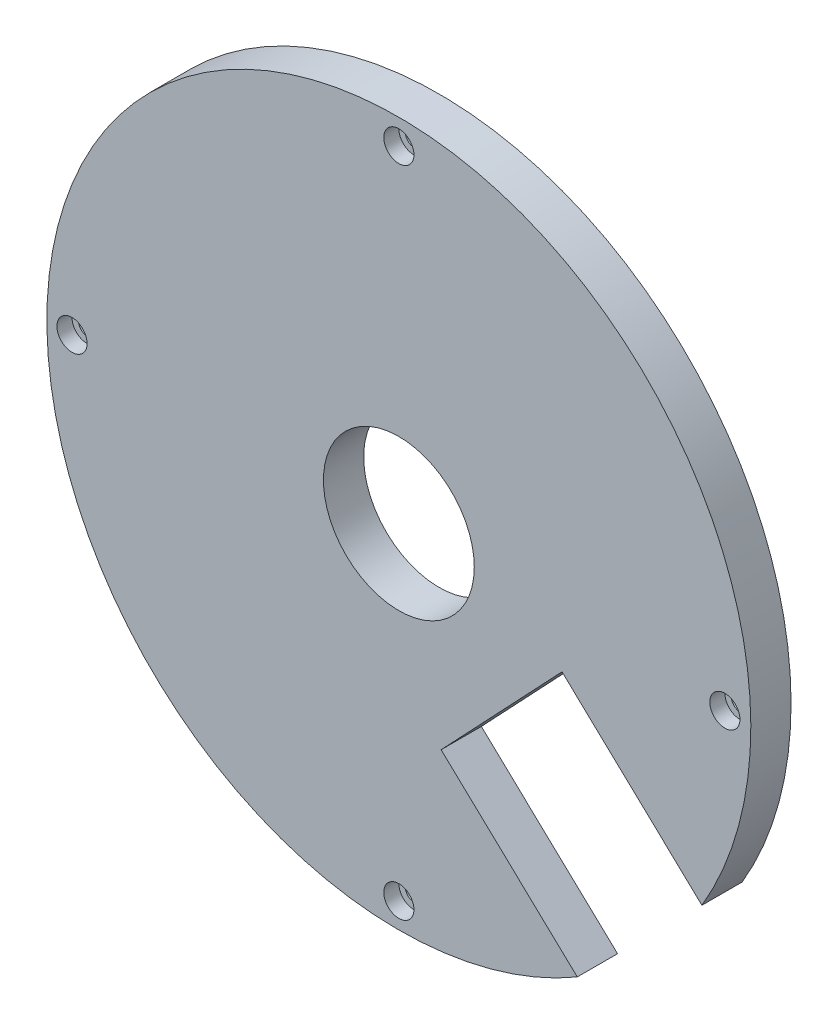
ISO-10303-21;
HEADER;
FILE_DESCRIPTION(('STEP AP214'),'2;1');
FILE_NAME('part.step','',(''),(''),'','','');
FILE_SCHEMA(('AUTOMOTIVE_DESIGN { 1 0 10303 214 1 1 1 1 }'));
ENDSEC;
DATA;
#1=APPLICATION_CONTEXT('core data for automotive mechanical design processes');
#2=APPLICATION_PROTOCOL_DEFINITION('international standard','automotive_design',2000,#1);
#3=PRODUCT_CONTEXT('',#1,'mechanical');
#4=PRODUCT('Part','Part','',(#3));
#5=PRODUCT_RELATED_PRODUCT_CATEGORY('part','',(#4));
#6=PRODUCT_DEFINITION_FORMATION('','',#4);
#7=PRODUCT_DEFINITION_CONTEXT('part definition',#1,'design');
#8=PRODUCT_DEFINITION('design','',#6,#7);
#9=PRODUCT_DEFINITION_SHAPE('','',#8);
#10=(LENGTH_UNIT() NAMED_UNIT(*) SI_UNIT(.MILLI.,.METRE.));
#11=(NAMED_UNIT(*) PLANE_ANGLE_UNIT() SI_UNIT($,.RADIAN.));
#12=(NAMED_UNIT(*) SI_UNIT($,.STERADIAN.) SOLID_ANGLE_UNIT());
#13=UNCERTAINTY_MEASURE_WITH_UNIT(LENGTH_MEASURE(1.E-05),#10,'distance_accuracy_value','');
#14=(GEOMETRIC_REPRESENTATION_CONTEXT(3) GLOBAL_UNCERTAINTY_ASSIGNED_CONTEXT((#13)) GLOBAL_UNIT_ASSIGNED_CONTEXT((#10,
#11,#12)) REPRESENTATION_CONTEXT('',''));
#15=CARTESIAN_POINT('',(0.,0.,0.));
#16=DIRECTION('',(0.,0.,1.));
#17=DIRECTION('',(1.,0.,0.));
#18=AXIS2_PLACEMENT_3D('',#15,#16,#17);
#19=CARTESIAN_POINT('',(-65.0000000000001,0.,0.));
#20=DIRECTION('',(0.,0.,1.));
#21=DIRECTION('',(1.,0.,0.));
#22=AXIS2_PLACEMENT_3D('',#19,#20,#21);
#23=CYLINDRICAL_SURFACE('',#22,1.7);
#24=CARTESIAN_POINT('',(-65.0000000000001,0.,0.));
#25=DIRECTION('',(0.,0.,1.));
#26=DIRECTION('',(1.,0.,0.));
#27=AXIS2_PLACEMENT_3D('',#24,#25,#26);
#28=CIRCLE('',#27,1.7);
#29=CARTESIAN_POINT('',(-63.3000000000001,0.,0.));
#30=VERTEX_POINT('',#29);
#31=EDGE_CURVE('E142',#30,#30,#28,.T.);
#32=ORIENTED_EDGE('',*,*,#31,.F.);
#33=EDGE_LOOP('',(#32));
#34=FACE_BOUND('',#33,.T.);
#35=CARTESIAN_POINT('',(-65.0000000000001,0.,5.));
#36=DIRECTION('',(0.,0.,1.));
#37=DIRECTION('',(1.,0.,0.));
#38=AXIS2_PLACEMENT_3D('',#35,#36,#37);
#39=CIRCLE('',#38,1.7);
#40=CARTESIAN_POINT('',(-63.3000000000001,0.,5.));
#41=VERTEX_POINT('',#40);
#42=EDGE_CURVE('E144',#41,#41,#39,.F.);
#43=ORIENTED_EDGE('',*,*,#42,.F.);
#44=EDGE_LOOP('',(#43));
#45=FACE_BOUND('',#44,.T.);
#46=ADVANCED_FACE('F39',(#34,#45),#23,.F.);
#47=CARTESIAN_POINT('',(0.,-65.0000000000001,0.));
#48=DIRECTION('',(0.,0.,1.));
#49=DIRECTION('',(1.,0.,0.));
#50=AXIS2_PLACEMENT_3D('',#47,#48,#49);
#51=CYLINDRICAL_SURFACE('',#50,1.7);
#52=CARTESIAN_POINT('',(0.,-65.0000000000001,0.));
#53=DIRECTION('',(0.,0.,1.));
#54=DIRECTION('',(1.,0.,0.));
#55=AXIS2_PLACEMENT_3D('',#52,#53,#54);
#56=CIRCLE('',#55,1.7);
#57=CARTESIAN_POINT('',(1.7,-65.0000000000001,0.));
#58=VERTEX_POINT('',#57);
#59=EDGE_CURVE('E136',#58,#58,#56,.T.);
#60=ORIENTED_EDGE('',*,*,#59,.F.);
#61=EDGE_LOOP('',(#60));
#62=FACE_BOUND('',#61,.T.);
#63=CARTESIAN_POINT('',(0.,-65.0000000000001,5.));
#64=DIRECTION('',(0.,0.,1.));
#65=DIRECTION('',(1.,0.,0.));
#66=AXIS2_PLACEMENT_3D('',#63,#64,#65);
#67=CIRCLE('',#66,1.7);
#68=CARTESIAN_POINT('',(1.7,-65.0000000000001,5.));
#69=VERTEX_POINT('',#68);
#70=EDGE_CURVE('E159',#69,#69,#67,.F.);
#71=ORIENTED_EDGE('',*,*,#70,.F.);
#72=EDGE_LOOP('',(#71));
#73=FACE_BOUND('',#72,.T.);
#74=ADVANCED_FACE('F183',(#62,#73),#51,.F.);
#75=CARTESIAN_POINT('',(64.8371966870419,0.189860019581431,0.));
#76=DIRECTION('',(0.,0.,1.));
#77=DIRECTION('',(1.,0.,0.));
#78=AXIS2_PLACEMENT_3D('',#75,#76,#77);
#79=CYLINDRICAL_SURFACE('',#78,1.70000000000001);
#80=CARTESIAN_POINT('',(64.8371966870419,0.189860019581431,0.));
#81=DIRECTION('',(0.,0.,1.));
#82=DIRECTION('',(1.,0.,0.));
#83=AXIS2_PLACEMENT_3D('',#80,#81,#82);
#84=CIRCLE('',#83,1.70000000000001);
#85=CARTESIAN_POINT('',(66.5371966870419,0.189860019581431,0.));
#86=VERTEX_POINT('',#85);
#87=EDGE_CURVE('E137',#86,#86,#84,.T.);
#88=ORIENTED_EDGE('',*,*,#87,.F.);
#89=EDGE_LOOP('',(#88));
#90=FACE_BOUND('',#89,.T.);
#91=CARTESIAN_POINT('',(64.8371966870419,0.189860019581431,5.));
#92=DIRECTION('',(0.,0.,1.));
#93=DIRECTION('',(1.,0.,0.));
#94=AXIS2_PLACEMENT_3D('',#91,#92,#93);
#95=CIRCLE('',#94,1.70000000000001);
#96=CARTESIAN_POINT('',(66.5371966870419,0.189860019581431,5.));
#97=VERTEX_POINT('',#96);
#98=EDGE_CURVE('E160',#97,#97,#95,.F.);
#99=ORIENTED_EDGE('',*,*,#98,.F.);
#100=EDGE_LOOP('',(#99));
#101=FACE_BOUND('',#100,.T.);
#102=ADVANCED_FACE('F195',(#90,#101),#79,.F.);
#103=CARTESIAN_POINT('',(0.,65.0000000000001,0.));
#104=DIRECTION('',(0.,0.,1.));
#105=DIRECTION('',(1.,0.,0.));
#106=AXIS2_PLACEMENT_3D('',#103,#104,#105);
#107=CYLINDRICAL_SURFACE('',#106,1.7);
#108=CARTESIAN_POINT('',(0.,65.0000000000001,0.));
#109=DIRECTION('',(0.,0.,1.));
#110=DIRECTION('',(1.,0.,0.));
#111=AXIS2_PLACEMENT_3D('',#108,#109,#110);
#112=CIRCLE('',#111,1.7);
#113=CARTESIAN_POINT('',(1.7,65.0000000000001,0.));
#114=VERTEX_POINT('',#113);
#115=EDGE_CURVE('E131',#114,#114,#112,.T.);
#116=ORIENTED_EDGE('',*,*,#115,.F.);
#117=EDGE_LOOP('',(#116));
#118=FACE_BOUND('',#117,.T.);
#119=CARTESIAN_POINT('',(0.,65.0000000000001,5.));
#120=DIRECTION('',(0.,0.,1.));
#121=DIRECTION('',(1.,0.,0.));
#122=AXIS2_PLACEMENT_3D('',#119,#120,#121);
#123=CIRCLE('',#122,1.7);
#124=CARTESIAN_POINT('',(1.7,65.0000000000001,5.));
#125=VERTEX_POINT('',#124);
#126=EDGE_CURVE('E112',#125,#125,#123,.F.);
#127=ORIENTED_EDGE('',*,*,#126,.F.);
#128=EDGE_LOOP('',(#127));
#129=FACE_BOUND('',#128,.T.);
#130=ADVANCED_FACE('F204',(#118,#129),#107,.F.);
#131=CARTESIAN_POINT('',(0.,0.,8.));
#132=DIRECTION('',(0.,0.,1.));
#133=DIRECTION('',(1.,0.,0.));
#134=AXIS2_PLACEMENT_3D('',#131,#132,#133);
#135=PLANE('',#134);
#136=DIRECTION('',(-0.726812132223926,0.686836315618292,0.));
#137=VECTOR('',#136,1.);
#138=CARTESIAN_POINT('',(90.5895954953354,-64.2517149938714,8.));
#139=LINE('',#138,#137);
#140=CARTESIAN_POINT('',(60.2709862462175,-35.6006771973269,8.));
#141=VERTEX_POINT('',#140);
#142=CARTESIAN_POINT('',(32.4446249174213,-9.30480974440805,8.));
#143=VERTEX_POINT('',#142);
#144=EDGE_CURVE('E82',#141,#143,#139,.T.);
#145=ORIENTED_EDGE('',*,*,#144,.F.);
#146=CARTESIAN_POINT('',(0.,0.,8.));
#147=DIRECTION('',(0.,0.,1.));
#148=DIRECTION('',(1.,0.,0.));
#149=AXIS2_PLACEMENT_3D('',#146,#147,#148);
#150=CIRCLE('',#149,70.);
#151=CARTESIAN_POINT('',(35.4887226911063,-60.3369750795792,8.));
#152=VERTEX_POINT('',#151);
#153=EDGE_CURVE('E151',#141,#152,#150,.T.);
#154=ORIENTED_EDGE('',*,*,#153,.T.);
#155=DIRECTION('',(0.726812132223926,-0.686836315618292,0.));
#156=VECTOR('',#155,1.);
#157=CARTESIAN_POINT('',(66.5503244486952,-89.6901396217088,8.));
#158=LINE('',#157,#156);
#159=CARTESIAN_POINT('',(8.40535387078107,-34.7432343722455,8.));
#160=VERTEX_POINT('',#159);
#161=EDGE_CURVE('E98',#160,#152,#158,.T.);
#162=ORIENTED_EDGE('',*,*,#161,.F.);
#163=DIRECTION('',(-0.686836315618292,-0.726812132223926,0.));
#164=VECTOR('',#163,1.);
#165=CARTESIAN_POINT('',(8.40535387078107,-34.7432343722455,8.));
#166=LINE('',#165,#164);
#167=EDGE_CURVE('E99',#143,#160,#166,.T.);
#168=ORIENTED_EDGE('',*,*,#167,.F.);
#169=EDGE_LOOP('',(#145,#154,#162,#168));
#170=FACE_BOUND('',#169,.T.);
#171=CARTESIAN_POINT('',(0.,65.0000000000001,8.));
#172=DIRECTION('',(0.,0.,1.));
#173=DIRECTION('',(1.,0.,0.));
#174=AXIS2_PLACEMENT_3D('',#171,#172,#173);
#175=CIRCLE('',#174,3.);
#176=CARTESIAN_POINT('',(3.,65.0000000000001,8.));
#177=VERTEX_POINT('',#176);
#178=EDGE_CURVE('E115',#177,#177,#175,.T.);
#179=ORIENTED_EDGE('',*,*,#178,.F.);
#180=EDGE_LOOP('',(#179));
#181=FACE_BOUND('',#180,.T.);
#182=CARTESIAN_POINT('',(64.8371966870419,0.189860019581431,8.));
#183=DIRECTION('',(0.,0.,1.));
#184=DIRECTION('',(1.,0.,0.));
#185=AXIS2_PLACEMENT_3D('',#182,#183,#184);
#186=CIRCLE('',#185,3.00000000000001);
#187=CARTESIAN_POINT('',(67.8371966870419,0.189860019581431,8.));
#188=VERTEX_POINT('',#187);
#189=EDGE_CURVE('E113',#188,#188,#186,.T.);
#190=ORIENTED_EDGE('',*,*,#189,.F.);
#191=EDGE_LOOP('',(#190));
#192=FACE_BOUND('',#191,.T.);
#193=CARTESIAN_POINT('',(0.,-65.0000000000001,8.));
#194=DIRECTION('',(0.,0.,1.));
#195=DIRECTION('',(1.,0.,0.));
#196=AXIS2_PLACEMENT_3D('',#193,#194,#195);
#197=CIRCLE('',#196,3.);
#198=CARTESIAN_POINT('',(3.,-65.0000000000001,8.));
#199=VERTEX_POINT('',#198);
#200=EDGE_CURVE('E122',#199,#199,#197,.T.);
#201=ORIENTED_EDGE('',*,*,#200,.F.);
#202=EDGE_LOOP('',(#201));
#203=FACE_BOUND('',#202,.T.);
#204=CARTESIAN_POINT('',(-65.0000000000001,0.,8.));
#205=DIRECTION('',(0.,0.,1.));
#206=DIRECTION('',(1.,0.,0.));
#207=AXIS2_PLACEMENT_3D('',#204,#205,#206);
#208=CIRCLE('',#207,3.);
#209=CARTESIAN_POINT('',(-62.0000000000001,0.,8.));
#210=VERTEX_POINT('',#209);
#211=EDGE_CURVE('E130',#210,#210,#208,.T.);
#212=ORIENTED_EDGE('',*,*,#211,.F.);
#213=EDGE_LOOP('',(#212));
#214=FACE_BOUND('',#213,.T.);
#215=CARTESIAN_POINT('',(0.,0.,8.));
#216=DIRECTION('',(0.,0.,1.));
#217=DIRECTION('',(1.,0.,0.));
#218=AXIS2_PLACEMENT_3D('',#215,#216,#217);
#219=CIRCLE('',#218,15.);
#220=CARTESIAN_POINT('',(15.,0.,8.));
#221=VERTEX_POINT('',#220);
#222=EDGE_CURVE('E148',#221,#221,#219,.T.);
#223=ORIENTED_EDGE('',*,*,#222,.F.);
#224=EDGE_LOOP('',(#223));
#225=FACE_BOUND('',#224,.T.);
#226=ADVANCED_FACE('F170',(#170,#181,#192,#203,#214,#225),#135,.T.);
#227=CARTESIAN_POINT('',(0.,0.,0.));
#228=DIRECTION('',(0.,0.,1.));
#229=DIRECTION('',(1.,0.,0.));
#230=AXIS2_PLACEMENT_3D('',#227,#228,#229);
#231=PLANE('',#230);
#232=ORIENTED_EDGE('',*,*,#115,.T.);
#233=EDGE_LOOP('',(#232));
#234=FACE_BOUND('',#233,.T.);
#235=ORIENTED_EDGE('',*,*,#87,.T.);
#236=EDGE_LOOP('',(#235));
#237=FACE_BOUND('',#236,.T.);
#238=ORIENTED_EDGE('',*,*,#59,.T.);
#239=EDGE_LOOP('',(#238));
#240=FACE_BOUND('',#239,.T.);
#241=ORIENTED_EDGE('',*,*,#31,.T.);
#242=EDGE_LOOP('',(#241));
#243=FACE_BOUND('',#242,.T.);
#244=DIRECTION('',(-0.686836315618292,-0.726812132223926,0.));
#245=VECTOR('',#244,1.);
#246=CARTESIAN_POINT('',(8.40535387078107,-34.7432343722455,0.));
#247=LINE('',#246,#245);
#248=CARTESIAN_POINT('',(32.4446249174213,-9.30480974440805,0.));
#249=VERTEX_POINT('',#248);
#250=CARTESIAN_POINT('',(8.40535387078107,-34.7432343722455,0.));
#251=VERTEX_POINT('',#250);
#252=EDGE_CURVE('E90',#249,#251,#247,.T.);
#253=ORIENTED_EDGE('',*,*,#252,.T.);
#254=DIRECTION('',(0.726812132223926,-0.686836315618292,0.));
#255=VECTOR('',#254,1.);
#256=CARTESIAN_POINT('',(66.5503244486952,-89.6901396217088,0.));
#257=LINE('',#256,#255);
#258=CARTESIAN_POINT('',(35.4887226911063,-60.3369750795792,0.));
#259=VERTEX_POINT('',#258);
#260=EDGE_CURVE('E88',#251,#259,#257,.T.);
#261=ORIENTED_EDGE('',*,*,#260,.T.);
#262=CARTESIAN_POINT('',(0.,0.,0.));
#263=DIRECTION('',(0.,0.,1.));
#264=DIRECTION('',(1.,0.,0.));
#265=AXIS2_PLACEMENT_3D('',#262,#263,#264);
#266=CIRCLE('',#265,70.);
#267=CARTESIAN_POINT('',(60.2709862462175,-35.6006771973269,0.));
#268=VERTEX_POINT('',#267);
#269=EDGE_CURVE('E100',#268,#259,#266,.T.);
#270=ORIENTED_EDGE('',*,*,#269,.F.);
#271=DIRECTION('',(-0.726812132223926,0.686836315618292,0.));
#272=VECTOR('',#271,1.);
#273=CARTESIAN_POINT('',(90.5895954953354,-64.2517149938714,0.));
#274=LINE('',#273,#272);
#275=EDGE_CURVE('E53',#268,#249,#274,.T.);
#276=ORIENTED_EDGE('',*,*,#275,.T.);
#277=EDGE_LOOP('',(#253,#261,#270,#276));
#278=FACE_BOUND('',#277,.T.);
#279=CARTESIAN_POINT('',(0.,0.,0.));
#280=DIRECTION('',(0.,0.,1.));
#281=DIRECTION('',(1.,0.,0.));
#282=AXIS2_PLACEMENT_3D('',#279,#280,#281);
#283=CIRCLE('',#282,15.);
#284=CARTESIAN_POINT('',(15.,0.,0.));
#285=VERTEX_POINT('',#284);
#286=EDGE_CURVE('E132',#285,#285,#283,.T.);
#287=ORIENTED_EDGE('',*,*,#286,.T.);
#288=EDGE_LOOP('',(#287));
#289=FACE_BOUND('',#288,.T.);
#290=ADVANCED_FACE('F94',(#234,#237,#240,#243,#278,#289),#231,.F.);
#291=CARTESIAN_POINT('',(0.,0.,8.));
#292=DIRECTION('',(0.,0.,-1.));
#293=DIRECTION('',(-1.,0.,0.));
#294=AXIS2_PLACEMENT_3D('',#291,#292,#293);
#295=CYLINDRICAL_SURFACE('',#294,70.);
#296=ORIENTED_EDGE('',*,*,#269,.T.);
#297=DIRECTION('',(0.,0.,-1.));
#298=VECTOR('',#297,1.);
#299=CARTESIAN_POINT('',(35.4887226911063,-60.3369750795792,8.));
#300=LINE('',#299,#298);
#301=EDGE_CURVE('E11',#259,#152,#300,.F.);
#302=ORIENTED_EDGE('',*,*,#301,.T.);
#303=ORIENTED_EDGE('',*,*,#153,.F.);
#304=DIRECTION('',(0.,0.,-1.));
#305=VECTOR('',#304,1.);
#306=CARTESIAN_POINT('',(60.2709862462175,-35.6006771973269,8.));
#307=LINE('',#306,#305);
#308=EDGE_CURVE('E50',#141,#268,#307,.T.);
#309=ORIENTED_EDGE('',*,*,#308,.T.);
#310=EDGE_LOOP('',(#296,#302,#303,#309));
#311=FACE_BOUND('',#310,.T.);
#312=ADVANCED_FACE('F41',(#311),#295,.T.);
#313=CARTESIAN_POINT('',(0.,0.,8.));
#314=DIRECTION('',(0.,0.,-1.));
#315=DIRECTION('',(-1.,0.,0.));
#316=AXIS2_PLACEMENT_3D('',#313,#314,#315);
#317=CYLINDRICAL_SURFACE('',#316,15.);
#318=ORIENTED_EDGE('',*,*,#222,.T.);
#319=EDGE_LOOP('',(#318));
#320=FACE_BOUND('',#319,.T.);
#321=ORIENTED_EDGE('',*,*,#286,.F.);
#322=EDGE_LOOP('',(#321));
#323=FACE_BOUND('',#322,.T.);
#324=ADVANCED_FACE('F200',(#320,#323),#317,.F.);
#325=CARTESIAN_POINT('',(0.,65.0000000000001,5.));
#326=DIRECTION('',(0.,0.,1.));
#327=DIRECTION('',(1.,0.,0.));
#328=AXIS2_PLACEMENT_3D('',#325,#326,#327);
#329=PLANE('',#328);
#330=CARTESIAN_POINT('',(0.,65.0000000000001,5.));
#331=DIRECTION('',(0.,0.,1.));
#332=DIRECTION('',(1.,0.,0.));
#333=AXIS2_PLACEMENT_3D('',#330,#331,#332);
#334=CIRCLE('',#333,3.);
#335=CARTESIAN_POINT('',(3.,65.0000000000001,5.));
#336=VERTEX_POINT('',#335);
#337=EDGE_CURVE('E107',#336,#336,#334,.T.);
#338=ORIENTED_EDGE('',*,*,#337,.T.);
#339=EDGE_LOOP('',(#338));
#340=FACE_BOUND('',#339,.T.);
#341=ORIENTED_EDGE('',*,*,#126,.T.);
#342=EDGE_LOOP('',(#341));
#343=FACE_BOUND('',#342,.T.);
#344=ADVANCED_FACE('F203',(#340,#343),#329,.T.);
#345=CARTESIAN_POINT('',(0.,65.0000000000001,5.));
#346=DIRECTION('',(0.,0.,1.));
#347=DIRECTION('',(1.,0.,0.));
#348=AXIS2_PLACEMENT_3D('',#345,#346,#347);
#349=CYLINDRICAL_SURFACE('',#348,3.);
#350=ORIENTED_EDGE('',*,*,#337,.F.);
#351=EDGE_LOOP('',(#350));
#352=FACE_BOUND('',#351,.T.);
#353=ORIENTED_EDGE('',*,*,#178,.T.);
#354=EDGE_LOOP('',(#353));
#355=FACE_BOUND('',#354,.T.);
#356=ADVANCED_FACE('F249',(#352,#355),#349,.F.);
#357=CARTESIAN_POINT('',(64.8371966870419,0.189860019581431,5.));
#358=DIRECTION('',(0.,0.,1.));
#359=DIRECTION('',(1.,0.,0.));
#360=AXIS2_PLACEMENT_3D('',#357,#358,#359);
#361=PLANE('',#360);
#362=CARTESIAN_POINT('',(64.8371966870419,0.189860019581431,5.));
#363=DIRECTION('',(0.,0.,1.));
#364=DIRECTION('',(1.,0.,0.));
#365=AXIS2_PLACEMENT_3D('',#362,#363,#364);
#366=CIRCLE('',#365,3.00000000000001);
#367=CARTESIAN_POINT('',(67.8371966870419,0.189860019581431,5.));
#368=VERTEX_POINT('',#367);
#369=EDGE_CURVE('E120',#368,#368,#366,.T.);
#370=ORIENTED_EDGE('',*,*,#369,.T.);
#371=EDGE_LOOP('',(#370));
#372=FACE_BOUND('',#371,.T.);
#373=ORIENTED_EDGE('',*,*,#98,.T.);
#374=EDGE_LOOP('',(#373));
#375=FACE_BOUND('',#374,.T.);
#376=ADVANCED_FACE('F227',(#372,#375),#361,.T.);
#377=CARTESIAN_POINT('',(64.8371966870419,0.189860019581431,5.));
#378=DIRECTION('',(0.,0.,1.));
#379=DIRECTION('',(1.,0.,0.));
#380=AXIS2_PLACEMENT_3D('',#377,#378,#379);
#381=CYLINDRICAL_SURFACE('',#380,3.00000000000001);
#382=ORIENTED_EDGE('',*,*,#369,.F.);
#383=EDGE_LOOP('',(#382));
#384=FACE_BOUND('',#383,.T.);
#385=ORIENTED_EDGE('',*,*,#189,.T.);
#386=EDGE_LOOP('',(#385));
#387=FACE_BOUND('',#386,.T.);
#388=ADVANCED_FACE('F222',(#384,#387),#381,.F.);
#389=CARTESIAN_POINT('',(0.,-65.0000000000001,5.));
#390=DIRECTION('',(0.,0.,1.));
#391=DIRECTION('',(1.,0.,0.));
#392=AXIS2_PLACEMENT_3D('',#389,#390,#391);
#393=PLANE('',#392);
#394=CARTESIAN_POINT('',(0.,-65.0000000000001,5.));
#395=DIRECTION('',(0.,0.,1.));
#396=DIRECTION('',(1.,0.,0.));
#397=AXIS2_PLACEMENT_3D('',#394,#395,#396);
#398=CIRCLE('',#397,3.);
#399=CARTESIAN_POINT('',(3.,-65.0000000000001,5.));
#400=VERTEX_POINT('',#399);
#401=EDGE_CURVE('E121',#400,#400,#398,.T.);
#402=ORIENTED_EDGE('',*,*,#401,.T.);
#403=EDGE_LOOP('',(#402));
#404=FACE_BOUND('',#403,.T.);
#405=ORIENTED_EDGE('',*,*,#70,.T.);
#406=EDGE_LOOP('',(#405));
#407=FACE_BOUND('',#406,.T.);
#408=ADVANCED_FACE('F217',(#404,#407),#393,.T.);
#409=CARTESIAN_POINT('',(0.,-65.0000000000001,5.));
#410=DIRECTION('',(0.,0.,1.));
#411=DIRECTION('',(1.,0.,0.));
#412=AXIS2_PLACEMENT_3D('',#409,#410,#411);
#413=CYLINDRICAL_SURFACE('',#412,3.);
#414=ORIENTED_EDGE('',*,*,#401,.F.);
#415=EDGE_LOOP('',(#414));
#416=FACE_BOUND('',#415,.T.);
#417=ORIENTED_EDGE('',*,*,#200,.T.);
#418=EDGE_LOOP('',(#417));
#419=FACE_BOUND('',#418,.T.);
#420=ADVANCED_FACE('F219',(#416,#419),#413,.F.);
#421=CARTESIAN_POINT('',(-65.0000000000001,0.,5.));
#422=DIRECTION('',(0.,0.,1.));
#423=DIRECTION('',(1.,0.,0.));
#424=AXIS2_PLACEMENT_3D('',#421,#422,#423);
#425=PLANE('',#424);
#426=CARTESIAN_POINT('',(-65.0000000000001,0.,5.));
#427=DIRECTION('',(0.,0.,1.));
#428=DIRECTION('',(1.,0.,0.));
#429=AXIS2_PLACEMENT_3D('',#426,#427,#428);
#430=CIRCLE('',#429,3.);
#431=CARTESIAN_POINT('',(-62.0000000000001,0.,5.));
#432=VERTEX_POINT('',#431);
#433=EDGE_CURVE('E106',#432,#432,#430,.T.);
#434=ORIENTED_EDGE('',*,*,#433,.T.);
#435=EDGE_LOOP('',(#434));
#436=FACE_BOUND('',#435,.T.);
#437=ORIENTED_EDGE('',*,*,#42,.T.);
#438=EDGE_LOOP('',(#437));
#439=FACE_BOUND('',#438,.T.);
#440=ADVANCED_FACE('F178',(#436,#439),#425,.T.);
#441=CARTESIAN_POINT('',(-65.0000000000001,0.,5.));
#442=DIRECTION('',(0.,0.,1.));
#443=DIRECTION('',(1.,0.,0.));
#444=AXIS2_PLACEMENT_3D('',#441,#442,#443);
#445=CYLINDRICAL_SURFACE('',#444,3.);
#446=ORIENTED_EDGE('',*,*,#433,.F.);
#447=EDGE_LOOP('',(#446));
#448=FACE_BOUND('',#447,.T.);
#449=ORIENTED_EDGE('',*,*,#211,.T.);
#450=EDGE_LOOP('',(#449));
#451=FACE_BOUND('',#450,.T.);
#452=ADVANCED_FACE('F171',(#448,#451),#445,.F.);
#453=CARTESIAN_POINT('',(66.5503244486952,-89.6901396217088,0.));
#454=DIRECTION('',(-0.686836315618292,-0.726812132223926,0.));
#455=DIRECTION('',(0.726812132223926,-0.686836315618292,0.));
#456=AXIS2_PLACEMENT_3D('',#453,#454,#455);
#457=PLANE('',#456);
#458=ORIENTED_EDGE('',*,*,#260,.F.);
#459=DIRECTION('',(0.,0.,1.));
#460=VECTOR('',#459,1.);
#461=CARTESIAN_POINT('',(8.40535387078107,-34.7432343722455,0.));
#462=LINE('',#461,#460);
#463=EDGE_CURVE('E83',#251,#160,#462,.T.);
#464=ORIENTED_EDGE('',*,*,#463,.T.);
#465=ORIENTED_EDGE('',*,*,#161,.T.);
#466=ORIENTED_EDGE('',*,*,#301,.F.);
#467=EDGE_LOOP('',(#458,#464,#465,#466));
#468=FACE_BOUND('',#467,.T.);
#469=ADVANCED_FACE('F168',(#468),#457,.F.);
#470=CARTESIAN_POINT('',(90.5895954953354,-64.2517149938714,0.));
#471=DIRECTION('',(0.686836315618292,0.726812132223926,0.));
#472=DIRECTION('',(-0.726812132223926,0.686836315618292,0.));
#473=AXIS2_PLACEMENT_3D('',#470,#471,#472);
#474=PLANE('',#473);
#475=ORIENTED_EDGE('',*,*,#144,.T.);
#476=DIRECTION('',(0.,0.,1.));
#477=VECTOR('',#476,1.);
#478=CARTESIAN_POINT('',(32.4446249174213,-9.30480974440805,0.));
#479=LINE('',#478,#477);
#480=EDGE_CURVE('E76',#249,#143,#479,.T.);
#481=ORIENTED_EDGE('',*,*,#480,.F.);
#482=ORIENTED_EDGE('',*,*,#275,.F.);
#483=ORIENTED_EDGE('',*,*,#308,.F.);
#484=EDGE_LOOP('',(#475,#481,#482,#483));
#485=FACE_BOUND('',#484,.T.);
#486=ADVANCED_FACE('F78',(#485),#474,.F.);
#487=CARTESIAN_POINT('',(8.40535387078107,-34.7432343722455,0.));
#488=DIRECTION('',(-0.726812132223926,0.686836315618292,0.));
#489=DIRECTION('',(-0.686836315618292,-0.726812132223926,0.));
#490=AXIS2_PLACEMENT_3D('',#487,#488,#489);
#491=PLANE('',#490);
#492=ORIENTED_EDGE('',*,*,#167,.T.);
#493=ORIENTED_EDGE('',*,*,#463,.F.);
#494=ORIENTED_EDGE('',*,*,#252,.F.);
#495=ORIENTED_EDGE('',*,*,#480,.T.);
#496=EDGE_LOOP('',(#492,#493,#494,#495));
#497=FACE_BOUND('',#496,.T.);
#498=ADVANCED_FACE('F89',(#497),#491,.F.);
#499=CLOSED_SHELL('',(#46,#74,#102,#130,#226,#290,#312,#324,#344,#356,#376,#388,#408,#420,#440,
#452,#469,#486,#498));
#500=MANIFOLD_SOLID_BREP('B2',#499);
#501=ADVANCED_BREP_SHAPE_REPRESENTATION('',(#18,#500),#14);
#502=SHAPE_DEFINITION_REPRESENTATION(#9,#501);
ENDSEC;
END-ISO-10303-21;
